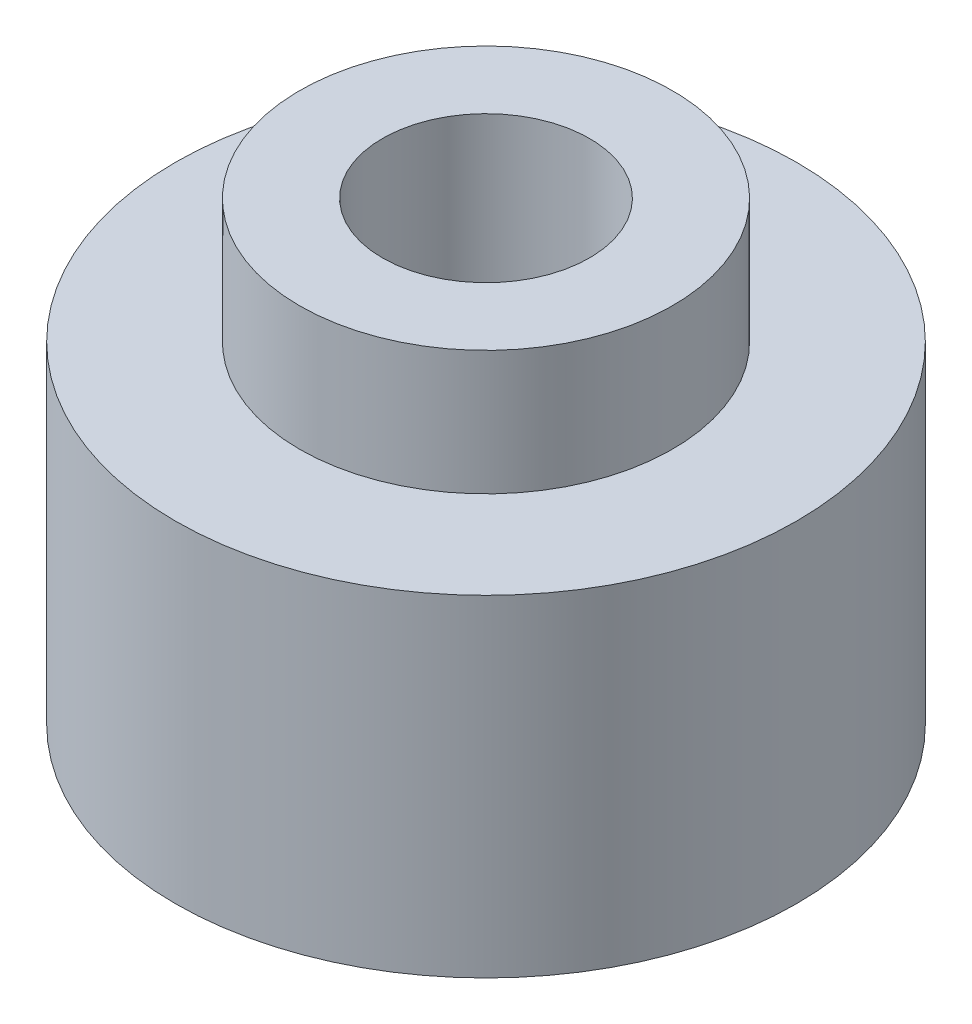
ISO-10303-21;
HEADER;
FILE_DESCRIPTION(('STEP AP214'),'2;1');
FILE_NAME('part.step','',(''),(''),'','','');
FILE_SCHEMA(('AUTOMOTIVE_DESIGN { 1 0 10303 214 1 1 1 1 }'));
ENDSEC;
DATA;
#1=APPLICATION_CONTEXT('core data for automotive mechanical design processes');
#2=APPLICATION_PROTOCOL_DEFINITION('international standard','automotive_design',2000,#1);
#3=PRODUCT_CONTEXT('',#1,'mechanical');
#4=PRODUCT('Part','Part','',(#3));
#5=PRODUCT_RELATED_PRODUCT_CATEGORY('part','',(#4));
#6=PRODUCT_DEFINITION_FORMATION('','',#4);
#7=PRODUCT_DEFINITION_CONTEXT('part definition',#1,'design');
#8=PRODUCT_DEFINITION('design','',#6,#7);
#9=PRODUCT_DEFINITION_SHAPE('','',#8);
#10=(LENGTH_UNIT() NAMED_UNIT(*) SI_UNIT(.MILLI.,.METRE.));
#11=(NAMED_UNIT(*) PLANE_ANGLE_UNIT() SI_UNIT($,.RADIAN.));
#12=(NAMED_UNIT(*) SI_UNIT($,.STERADIAN.) SOLID_ANGLE_UNIT());
#13=UNCERTAINTY_MEASURE_WITH_UNIT(LENGTH_MEASURE(1.E-05),#10,'distance_accuracy_value','');
#14=(GEOMETRIC_REPRESENTATION_CONTEXT(3) GLOBAL_UNCERTAINTY_ASSIGNED_CONTEXT((#13)) GLOBAL_UNIT_ASSIGNED_CONTEXT((#10,
#11,#12)) REPRESENTATION_CONTEXT('',''));
#15=CARTESIAN_POINT('',(0.,0.,0.));
#16=DIRECTION('',(0.,0.,1.));
#17=DIRECTION('',(1.,0.,0.));
#18=AXIS2_PLACEMENT_3D('',#15,#16,#17);
#19=CARTESIAN_POINT('',(0.,11.,0.));
#20=DIRECTION('',(0.,-1.,0.));
#21=DIRECTION('',(0.,0.,-1.));
#22=AXIS2_PLACEMENT_3D('',#19,#20,#21);
#23=CYLINDRICAL_SURFACE('',#22,7.5);
#24=CARTESIAN_POINT('',(0.,0.,0.));
#25=DIRECTION('',(0.,1.,0.));
#26=DIRECTION('',(0.,0.,1.));
#27=AXIS2_PLACEMENT_3D('',#24,#25,#26);
#28=CIRCLE('',#27,7.5);
#29=CARTESIAN_POINT('',(0.,0.,7.5));
#30=VERTEX_POINT('',#29);
#31=EDGE_CURVE('E11',#30,#30,#28,.T.);
#32=ORIENTED_EDGE('',*,*,#31,.T.);
#33=EDGE_LOOP('',(#32));
#34=FACE_BOUND('',#33,.T.);
#35=CARTESIAN_POINT('',(0.,8.,0.));
#36=DIRECTION('',(0.,1.,0.));
#37=DIRECTION('',(0.,0.,1.));
#38=AXIS2_PLACEMENT_3D('',#35,#36,#37);
#39=CIRCLE('',#38,7.5);
#40=CARTESIAN_POINT('',(0.,8.,7.5));
#41=VERTEX_POINT('',#40);
#42=EDGE_CURVE('E54',#41,#41,#39,.T.);
#43=ORIENTED_EDGE('',*,*,#42,.F.);
#44=EDGE_LOOP('',(#43));
#45=FACE_BOUND('',#44,.T.);
#46=ADVANCED_FACE('F37',(#34,#45),#23,.T.);
#47=CARTESIAN_POINT('',(0.,11.,0.));
#48=DIRECTION('',(0.,1.,0.));
#49=DIRECTION('',(0.,0.,1.));
#50=AXIS2_PLACEMENT_3D('',#47,#48,#49);
#51=PLANE('',#50);
#52=CARTESIAN_POINT('',(0.,11.,0.));
#53=DIRECTION('',(0.,1.,0.));
#54=DIRECTION('',(0.,0.,1.));
#55=AXIS2_PLACEMENT_3D('',#52,#53,#54);
#56=CIRCLE('',#55,2.5);
#57=CARTESIAN_POINT('',(0.,11.,2.5));
#58=VERTEX_POINT('',#57);
#59=EDGE_CURVE('E48',#58,#58,#56,.T.);
#60=ORIENTED_EDGE('',*,*,#59,.F.);
#61=EDGE_LOOP('',(#60));
#62=FACE_BOUND('',#61,.T.);
#63=CARTESIAN_POINT('',(0.,11.,0.));
#64=DIRECTION('',(0.,1.,0.));
#65=DIRECTION('',(0.,0.,1.));
#66=AXIS2_PLACEMENT_3D('',#63,#64,#65);
#67=CIRCLE('',#66,4.5);
#68=CARTESIAN_POINT('',(0.,11.,4.5));
#69=VERTEX_POINT('',#68);
#70=EDGE_CURVE('E60',#69,#69,#67,.T.);
#71=ORIENTED_EDGE('',*,*,#70,.T.);
#72=EDGE_LOOP('',(#71));
#73=FACE_BOUND('',#72,.T.);
#74=ADVANCED_FACE('F77',(#62,#73),#51,.T.);
#75=CARTESIAN_POINT('',(0.,0.,0.));
#76=DIRECTION('',(0.,1.,0.));
#77=DIRECTION('',(0.,0.,1.));
#78=AXIS2_PLACEMENT_3D('',#75,#76,#77);
#79=PLANE('',#78);
#80=CARTESIAN_POINT('',(0.,0.,0.));
#81=DIRECTION('',(0.,1.,0.));
#82=DIRECTION('',(0.,0.,1.));
#83=AXIS2_PLACEMENT_3D('',#80,#81,#82);
#84=CIRCLE('',#83,2.5);
#85=CARTESIAN_POINT('',(0.,0.,2.5));
#86=VERTEX_POINT('',#85);
#87=EDGE_CURVE('E43',#86,#86,#84,.T.);
#88=ORIENTED_EDGE('',*,*,#87,.T.);
#89=EDGE_LOOP('',(#88));
#90=FACE_BOUND('',#89,.T.);
#91=ORIENTED_EDGE('',*,*,#31,.F.);
#92=EDGE_LOOP('',(#91));
#93=FACE_BOUND('',#92,.T.);
#94=ADVANCED_FACE('F81',(#90,#93),#79,.F.);
#95=CARTESIAN_POINT('',(0.,0.,0.));
#96=DIRECTION('',(0.,1.,0.));
#97=DIRECTION('',(0.,0.,1.));
#98=AXIS2_PLACEMENT_3D('',#95,#96,#97);
#99=CYLINDRICAL_SURFACE('',#98,2.5);
#100=ORIENTED_EDGE('',*,*,#87,.F.);
#101=EDGE_LOOP('',(#100));
#102=FACE_BOUND('',#101,.T.);
#103=ORIENTED_EDGE('',*,*,#59,.T.);
#104=EDGE_LOOP('',(#103));
#105=FACE_BOUND('',#104,.T.);
#106=ADVANCED_FACE('F72',(#102,#105),#99,.F.);
#107=CARTESIAN_POINT('',(0.,8.,0.));
#108=DIRECTION('',(0.,1.,0.));
#109=DIRECTION('',(0.,0.,1.));
#110=AXIS2_PLACEMENT_3D('',#107,#108,#109);
#111=PLANE('',#110);
#112=CARTESIAN_POINT('',(0.,8.,0.));
#113=DIRECTION('',(0.,1.,0.));
#114=DIRECTION('',(0.,0.,1.));
#115=AXIS2_PLACEMENT_3D('',#112,#113,#114);
#116=CIRCLE('',#115,4.5);
#117=CARTESIAN_POINT('',(0.,8.,4.5));
#118=VERTEX_POINT('',#117);
#119=EDGE_CURVE('E59',#118,#118,#116,.T.);
#120=ORIENTED_EDGE('',*,*,#119,.F.);
#121=EDGE_LOOP('',(#120));
#122=FACE_BOUND('',#121,.T.);
#123=ORIENTED_EDGE('',*,*,#42,.T.);
#124=EDGE_LOOP('',(#123));
#125=FACE_BOUND('',#124,.T.);
#126=ADVANCED_FACE('F69',(#122,#125),#111,.T.);
#127=CARTESIAN_POINT('',(0.,8.,0.));
#128=DIRECTION('',(0.,1.,0.));
#129=DIRECTION('',(0.,0.,1.));
#130=AXIS2_PLACEMENT_3D('',#127,#128,#129);
#131=CYLINDRICAL_SURFACE('',#130,4.5);
#132=ORIENTED_EDGE('',*,*,#119,.T.);
#133=EDGE_LOOP('',(#132));
#134=FACE_BOUND('',#133,.T.);
#135=ORIENTED_EDGE('',*,*,#70,.F.);
#136=EDGE_LOOP('',(#135));
#137=FACE_BOUND('',#136,.T.);
#138=ADVANCED_FACE('F66',(#134,#137),#131,.T.);
#139=CLOSED_SHELL('',(#46,#74,#94,#106,#126,#138));
#140=MANIFOLD_SOLID_BREP('B2',#139);
#141=ADVANCED_BREP_SHAPE_REPRESENTATION('',(#18,#140),#14);
#142=SHAPE_DEFINITION_REPRESENTATION(#9,#141);
ENDSEC;
END-ISO-10303-21;
